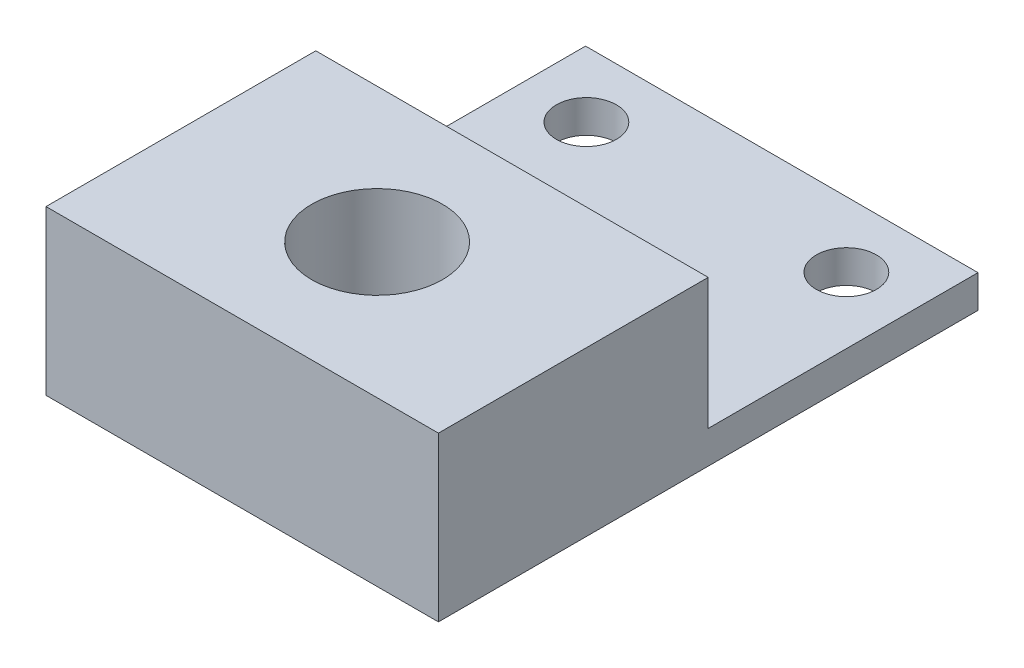
ISO-10303-21;
HEADER;
FILE_DESCRIPTION(('STEP AP214'),'2;1');
FILE_NAME('part.step','',(''),(''),'','','');
FILE_SCHEMA(('AUTOMOTIVE_DESIGN { 1 0 10303 214 1 1 1 1 }'));
ENDSEC;
DATA;
#1=APPLICATION_CONTEXT('core data for automotive mechanical design processes');
#2=APPLICATION_PROTOCOL_DEFINITION('international standard','automotive_design',2000,#1);
#3=PRODUCT_CONTEXT('',#1,'mechanical');
#4=PRODUCT('Part','Part','',(#3));
#5=PRODUCT_RELATED_PRODUCT_CATEGORY('part','',(#4));
#6=PRODUCT_DEFINITION_FORMATION('','',#4);
#7=PRODUCT_DEFINITION_CONTEXT('part definition',#1,'design');
#8=PRODUCT_DEFINITION('design','',#6,#7);
#9=PRODUCT_DEFINITION_SHAPE('','',#8);
#10=(LENGTH_UNIT() NAMED_UNIT(*) SI_UNIT(.MILLI.,.METRE.));
#11=(NAMED_UNIT(*) PLANE_ANGLE_UNIT() SI_UNIT($,.RADIAN.));
#12=(NAMED_UNIT(*) SI_UNIT($,.STERADIAN.) SOLID_ANGLE_UNIT());
#13=UNCERTAINTY_MEASURE_WITH_UNIT(LENGTH_MEASURE(1.E-05),#10,'distance_accuracy_value','');
#14=(GEOMETRIC_REPRESENTATION_CONTEXT(3) GLOBAL_UNCERTAINTY_ASSIGNED_CONTEXT((#13)) GLOBAL_UNIT_ASSIGNED_CONTEXT((#10,
#11,#12)) REPRESENTATION_CONTEXT('',''));
#15=CARTESIAN_POINT('',(0.,0.,0.));
#16=DIRECTION('',(0.,0.,1.));
#17=DIRECTION('',(1.,0.,0.));
#18=AXIS2_PLACEMENT_3D('',#15,#16,#17);
#19=CARTESIAN_POINT('',(0.,10.,0.));
#20=DIRECTION('',(0.,0.,-1.));
#21=DIRECTION('',(-1.,0.,0.));
#22=AXIS2_PLACEMENT_3D('',#19,#20,#21);
#23=PLANE('',#22);
#24=DIRECTION('',(1.,0.,0.));
#25=VECTOR('',#24,1.);
#26=CARTESIAN_POINT('',(0.,2.,0.));
#27=LINE('',#26,#25);
#28=CARTESIAN_POINT('',(-12.,2.,0.));
#29=VERTEX_POINT('',#28);
#30=CARTESIAN_POINT('',(12.,2.,0.));
#31=VERTEX_POINT('',#30);
#32=EDGE_CURVE('E59',#29,#31,#27,.T.);
#33=ORIENTED_EDGE('',*,*,#32,.F.);
#34=DIRECTION('',(0.,-1.,0.));
#35=VECTOR('',#34,1.);
#36=CARTESIAN_POINT('',(-12.,10.,0.));
#37=LINE('',#36,#35);
#38=CARTESIAN_POINT('',(-12.,10.,0.));
#39=VERTEX_POINT('',#38);
#40=EDGE_CURVE('E11',#39,#29,#37,.T.);
#41=ORIENTED_EDGE('',*,*,#40,.F.);
#42=DIRECTION('',(1.,0.,0.));
#43=VECTOR('',#42,1.);
#44=CARTESIAN_POINT('',(0.,10.,0.));
#45=LINE('',#44,#43);
#46=CARTESIAN_POINT('',(12.,10.,0.));
#47=VERTEX_POINT('',#46);
#48=EDGE_CURVE('E100',#39,#47,#45,.T.);
#49=ORIENTED_EDGE('',*,*,#48,.T.);
#50=DIRECTION('',(0.,-1.,0.));
#51=VECTOR('',#50,1.);
#52=CARTESIAN_POINT('',(12.,10.,0.));
#53=LINE('',#52,#51);
#54=EDGE_CURVE('E99',#47,#31,#53,.T.);
#55=ORIENTED_EDGE('',*,*,#54,.T.);
#56=EDGE_LOOP('',(#33,#41,#49,#55));
#57=FACE_BOUND('',#56,.T.);
#58=ADVANCED_FACE('F43',(#57),#23,.T.);
#59=CARTESIAN_POINT('',(-12.,10.,0.));
#60=DIRECTION('',(-1.,0.,0.));
#61=DIRECTION('',(0.,0.,1.));
#62=AXIS2_PLACEMENT_3D('',#59,#60,#61);
#63=PLANE('',#62);
#64=DIRECTION('',(0.,0.,-1.));
#65=VECTOR('',#64,1.);
#66=CARTESIAN_POINT('',(-12.,0.,0.));
#67=LINE('',#66,#65);
#68=CARTESIAN_POINT('',(-12.,0.,16.5));
#69=VERTEX_POINT('',#68);
#70=CARTESIAN_POINT('',(-12.,0.,-16.5));
#71=VERTEX_POINT('',#70);
#72=EDGE_CURVE('E172',#69,#71,#67,.T.);
#73=ORIENTED_EDGE('',*,*,#72,.F.);
#74=DIRECTION('',(0.,-1.,0.));
#75=VECTOR('',#74,1.);
#76=CARTESIAN_POINT('',(-12.,10.,16.5));
#77=LINE('',#76,#75);
#78=CARTESIAN_POINT('',(-12.,10.,16.5));
#79=VERTEX_POINT('',#78);
#80=EDGE_CURVE('E52',#79,#69,#77,.T.);
#81=ORIENTED_EDGE('',*,*,#80,.F.);
#82=DIRECTION('',(0.,0.,-1.));
#83=VECTOR('',#82,1.);
#84=CARTESIAN_POINT('',(-12.,10.,0.));
#85=LINE('',#84,#83);
#86=EDGE_CURVE('E159',#79,#39,#85,.T.);
#87=ORIENTED_EDGE('',*,*,#86,.T.);
#88=ORIENTED_EDGE('',*,*,#40,.T.);
#89=DIRECTION('',(0.,0.,-1.));
#90=VECTOR('',#89,1.);
#91=CARTESIAN_POINT('',(-12.,2.,0.));
#92=LINE('',#91,#90);
#93=CARTESIAN_POINT('',(-12.,2.,-16.5));
#94=VERTEX_POINT('',#93);
#95=EDGE_CURVE('E111',#29,#94,#92,.T.);
#96=ORIENTED_EDGE('',*,*,#95,.T.);
#97=DIRECTION('',(0.,-1.,0.));
#98=VECTOR('',#97,1.);
#99=CARTESIAN_POINT('',(-12.,2.,-16.5));
#100=LINE('',#99,#98);
#101=EDGE_CURVE('E133',#94,#71,#100,.T.);
#102=ORIENTED_EDGE('',*,*,#101,.T.);
#103=EDGE_LOOP('',(#73,#81,#87,#88,#96,#102));
#104=FACE_BOUND('',#103,.T.);
#105=ADVANCED_FACE('F189',(#104),#63,.T.);
#106=CARTESIAN_POINT('',(0.,10.,16.5));
#107=DIRECTION('',(0.,0.,1.));
#108=DIRECTION('',(1.,0.,0.));
#109=AXIS2_PLACEMENT_3D('',#106,#107,#108);
#110=PLANE('',#109);
#111=DIRECTION('',(-1.,0.,0.));
#112=VECTOR('',#111,1.);
#113=CARTESIAN_POINT('',(0.,0.,16.5));
#114=LINE('',#113,#112);
#115=CARTESIAN_POINT('',(12.,0.,16.5));
#116=VERTEX_POINT('',#115);
#117=EDGE_CURVE('E175',#116,#69,#114,.T.);
#118=ORIENTED_EDGE('',*,*,#117,.F.);
#119=DIRECTION('',(0.,-1.,0.));
#120=VECTOR('',#119,1.);
#121=CARTESIAN_POINT('',(12.,10.,16.5));
#122=LINE('',#121,#120);
#123=CARTESIAN_POINT('',(12.,10.,16.5));
#124=VERTEX_POINT('',#123);
#125=EDGE_CURVE('E82',#124,#116,#122,.T.);
#126=ORIENTED_EDGE('',*,*,#125,.F.);
#127=DIRECTION('',(-1.,0.,0.));
#128=VECTOR('',#127,1.);
#129=CARTESIAN_POINT('',(0.,10.,16.5));
#130=LINE('',#129,#128);
#131=EDGE_CURVE('E163',#124,#79,#130,.T.);
#132=ORIENTED_EDGE('',*,*,#131,.T.);
#133=ORIENTED_EDGE('',*,*,#80,.T.);
#134=EDGE_LOOP('',(#118,#126,#132,#133));
#135=FACE_BOUND('',#134,.T.);
#136=ADVANCED_FACE('F186',(#135),#110,.T.);
#137=CARTESIAN_POINT('',(0.,10.,8.25000000000001));
#138=DIRECTION('',(0.,-1.,0.));
#139=DIRECTION('',(0.,0.,-1.));
#140=AXIS2_PLACEMENT_3D('',#137,#138,#139);
#141=CYLINDRICAL_SURFACE('',#140,4.);
#142=CARTESIAN_POINT('',(0.,10.,8.25000000000001));
#143=DIRECTION('',(0.,1.,0.));
#144=DIRECTION('',(0.,0.,1.));
#145=AXIS2_PLACEMENT_3D('',#142,#143,#144);
#146=CIRCLE('',#145,4.);
#147=CARTESIAN_POINT('',(0.,10.,12.25));
#148=VERTEX_POINT('',#147);
#149=EDGE_CURVE('E152',#148,#148,#146,.T.);
#150=ORIENTED_EDGE('',*,*,#149,.T.);
#151=EDGE_LOOP('',(#150));
#152=FACE_BOUND('',#151,.T.);
#153=CARTESIAN_POINT('',(0.,0.,8.25000000000001));
#154=DIRECTION('',(0.,1.,0.));
#155=DIRECTION('',(0.,0.,1.));
#156=AXIS2_PLACEMENT_3D('',#153,#154,#155);
#157=CIRCLE('',#156,4.);
#158=CARTESIAN_POINT('',(0.,0.,12.25));
#159=VERTEX_POINT('',#158);
#160=EDGE_CURVE('E151',#159,#159,#157,.T.);
#161=ORIENTED_EDGE('',*,*,#160,.F.);
#162=EDGE_LOOP('',(#161));
#163=FACE_BOUND('',#162,.T.);
#164=ADVANCED_FACE('F45',(#152,#163),#141,.F.);
#165=CARTESIAN_POINT('',(12.,10.,0.));
#166=DIRECTION('',(-1.,0.,0.));
#167=DIRECTION('',(0.,0.,1.));
#168=AXIS2_PLACEMENT_3D('',#165,#166,#167);
#169=PLANE('',#168);
#170=DIRECTION('',(0.,0.,-1.));
#171=VECTOR('',#170,1.);
#172=CARTESIAN_POINT('',(12.,0.,0.));
#173=LINE('',#172,#171);
#174=CARTESIAN_POINT('',(12.,0.,-16.5));
#175=VERTEX_POINT('',#174);
#176=EDGE_CURVE('E156',#116,#175,#173,.T.);
#177=ORIENTED_EDGE('',*,*,#176,.T.);
#178=DIRECTION('',(0.,-1.,0.));
#179=VECTOR('',#178,1.);
#180=CARTESIAN_POINT('',(12.,2.,-16.5));
#181=LINE('',#180,#179);
#182=CARTESIAN_POINT('',(12.,2.,-16.5));
#183=VERTEX_POINT('',#182);
#184=EDGE_CURVE('E116',#183,#175,#181,.T.);
#185=ORIENTED_EDGE('',*,*,#184,.F.);
#186=DIRECTION('',(0.,0.,-1.));
#187=VECTOR('',#186,1.);
#188=CARTESIAN_POINT('',(12.,2.,0.));
#189=LINE('',#188,#187);
#190=EDGE_CURVE('E108',#31,#183,#189,.T.);
#191=ORIENTED_EDGE('',*,*,#190,.F.);
#192=ORIENTED_EDGE('',*,*,#54,.F.);
#193=DIRECTION('',(0.,0.,-1.));
#194=VECTOR('',#193,1.);
#195=CARTESIAN_POINT('',(12.,10.,0.));
#196=LINE('',#195,#194);
#197=EDGE_CURVE('E67',#124,#47,#196,.T.);
#198=ORIENTED_EDGE('',*,*,#197,.F.);
#199=ORIENTED_EDGE('',*,*,#125,.T.);
#200=EDGE_LOOP('',(#177,#185,#191,#192,#198,#199));
#201=FACE_BOUND('',#200,.T.);
#202=ADVANCED_FACE('F114',(#201),#169,.F.);
#203=CARTESIAN_POINT('',(0.,10.,0.));
#204=DIRECTION('',(0.,1.,0.));
#205=DIRECTION('',(0.,0.,1.));
#206=AXIS2_PLACEMENT_3D('',#203,#204,#205);
#207=PLANE('',#206);
#208=ORIENTED_EDGE('',*,*,#149,.F.);
#209=EDGE_LOOP('',(#208));
#210=FACE_BOUND('',#209,.T.);
#211=ORIENTED_EDGE('',*,*,#48,.F.);
#212=ORIENTED_EDGE('',*,*,#86,.F.);
#213=ORIENTED_EDGE('',*,*,#131,.F.);
#214=ORIENTED_EDGE('',*,*,#197,.T.);
#215=EDGE_LOOP('',(#211,#212,#213,#214));
#216=FACE_BOUND('',#215,.T.);
#217=ADVANCED_FACE('F198',(#210,#216),#207,.T.);
#218=CARTESIAN_POINT('',(0.,0.,0.));
#219=DIRECTION('',(0.,1.,0.));
#220=DIRECTION('',(0.,0.,1.));
#221=AXIS2_PLACEMENT_3D('',#218,#219,#220);
#222=PLANE('',#221);
#223=ORIENTED_EDGE('',*,*,#160,.T.);
#224=EDGE_LOOP('',(#223));
#225=FACE_BOUND('',#224,.T.);
#226=ORIENTED_EDGE('',*,*,#72,.T.);
#227=DIRECTION('',(-1.,0.,0.));
#228=VECTOR('',#227,1.);
#229=CARTESIAN_POINT('',(0.,0.,-16.5));
#230=LINE('',#229,#228);
#231=EDGE_CURVE('E134',#175,#71,#230,.T.);
#232=ORIENTED_EDGE('',*,*,#231,.F.);
#233=ORIENTED_EDGE('',*,*,#176,.F.);
#234=ORIENTED_EDGE('',*,*,#117,.T.);
#235=EDGE_LOOP('',(#226,#232,#233,#234));
#236=FACE_BOUND('',#235,.T.);
#237=CARTESIAN_POINT('',(-7.95,0.,-12.5));
#238=DIRECTION('',(0.,1.,0.));
#239=DIRECTION('',(0.,0.,1.));
#240=AXIS2_PLACEMENT_3D('',#237,#238,#239);
#241=CIRCLE('',#240,1.835);
#242=CARTESIAN_POINT('',(-7.95,0.,-10.665));
#243=VERTEX_POINT('',#242);
#244=EDGE_CURVE('E138',#243,#243,#241,.T.);
#245=ORIENTED_EDGE('',*,*,#244,.T.);
#246=EDGE_LOOP('',(#245));
#247=FACE_BOUND('',#246,.T.);
#248=CARTESIAN_POINT('',(7.95,0.,-12.5));
#249=DIRECTION('',(0.,1.,0.));
#250=DIRECTION('',(0.,0.,1.));
#251=AXIS2_PLACEMENT_3D('',#248,#249,#250);
#252=CIRCLE('',#251,1.835);
#253=CARTESIAN_POINT('',(7.95,0.,-10.665));
#254=VERTEX_POINT('',#253);
#255=EDGE_CURVE('E142',#254,#254,#252,.F.);
#256=ORIENTED_EDGE('',*,*,#255,.F.);
#257=EDGE_LOOP('',(#256));
#258=FACE_BOUND('',#257,.T.);
#259=ADVANCED_FACE('F193',(#225,#236,#247,#258),#222,.F.);
#260=CARTESIAN_POINT('',(-7.95,2.,-12.5));
#261=DIRECTION('',(0.,-1.,0.));
#262=DIRECTION('',(0.,0.,-1.));
#263=AXIS2_PLACEMENT_3D('',#260,#261,#262);
#264=CYLINDRICAL_SURFACE('',#263,1.835);
#265=CARTESIAN_POINT('',(-7.95,2.,-12.5));
#266=DIRECTION('',(0.,1.,0.));
#267=DIRECTION('',(0.,0.,1.));
#268=AXIS2_PLACEMENT_3D('',#265,#266,#267);
#269=CIRCLE('',#268,1.835);
#270=CARTESIAN_POINT('',(-7.95,2.,-10.665));
#271=VERTEX_POINT('',#270);
#272=EDGE_CURVE('E122',#271,#271,#269,.T.);
#273=ORIENTED_EDGE('',*,*,#272,.T.);
#274=EDGE_LOOP('',(#273));
#275=FACE_BOUND('',#274,.T.);
#276=ORIENTED_EDGE('',*,*,#244,.F.);
#277=EDGE_LOOP('',(#276));
#278=FACE_BOUND('',#277,.T.);
#279=ADVANCED_FACE('F206',(#275,#278),#264,.F.);
#280=CARTESIAN_POINT('',(0.,2.,-16.5));
#281=DIRECTION('',(0.,0.,1.));
#282=DIRECTION('',(1.,0.,0.));
#283=AXIS2_PLACEMENT_3D('',#280,#281,#282);
#284=PLANE('',#283);
#285=ORIENTED_EDGE('',*,*,#231,.T.);
#286=ORIENTED_EDGE('',*,*,#101,.F.);
#287=DIRECTION('',(-1.,0.,0.));
#288=VECTOR('',#287,1.);
#289=CARTESIAN_POINT('',(0.,2.,-16.5));
#290=LINE('',#289,#288);
#291=EDGE_CURVE('E119',#183,#94,#290,.T.);
#292=ORIENTED_EDGE('',*,*,#291,.F.);
#293=ORIENTED_EDGE('',*,*,#184,.T.);
#294=EDGE_LOOP('',(#285,#286,#292,#293));
#295=FACE_BOUND('',#294,.T.);
#296=ADVANCED_FACE('F196',(#295),#284,.F.);
#297=CARTESIAN_POINT('',(7.95,2.,-12.5));
#298=DIRECTION('',(0.,-1.,0.));
#299=DIRECTION('',(0.,0.,-1.));
#300=AXIS2_PLACEMENT_3D('',#297,#298,#299);
#301=CYLINDRICAL_SURFACE('',#300,1.835);
#302=CARTESIAN_POINT('',(7.95,2.,-12.5));
#303=DIRECTION('',(0.,1.,0.));
#304=DIRECTION('',(0.,0.,1.));
#305=AXIS2_PLACEMENT_3D('',#302,#303,#304);
#306=CIRCLE('',#305,1.835);
#307=CARTESIAN_POINT('',(7.95,2.,-10.665));
#308=VERTEX_POINT('',#307);
#309=EDGE_CURVE('E129',#308,#308,#306,.F.);
#310=ORIENTED_EDGE('',*,*,#309,.F.);
#311=EDGE_LOOP('',(#310));
#312=FACE_BOUND('',#311,.T.);
#313=ORIENTED_EDGE('',*,*,#255,.T.);
#314=EDGE_LOOP('',(#313));
#315=FACE_BOUND('',#314,.T.);
#316=ADVANCED_FACE('F261',(#312,#315),#301,.F.);
#317=CARTESIAN_POINT('',(0.,2.,0.));
#318=DIRECTION('',(0.,1.,0.));
#319=DIRECTION('',(0.,0.,1.));
#320=AXIS2_PLACEMENT_3D('',#317,#318,#319);
#321=PLANE('',#320);
#322=ORIENTED_EDGE('',*,*,#95,.F.);
#323=ORIENTED_EDGE('',*,*,#32,.T.);
#324=ORIENTED_EDGE('',*,*,#190,.T.);
#325=ORIENTED_EDGE('',*,*,#291,.T.);
#326=EDGE_LOOP('',(#322,#323,#324,#325));
#327=FACE_BOUND('',#326,.T.);
#328=ORIENTED_EDGE('',*,*,#272,.F.);
#329=EDGE_LOOP('',(#328));
#330=FACE_BOUND('',#329,.T.);
#331=ORIENTED_EDGE('',*,*,#309,.T.);
#332=EDGE_LOOP('',(#331));
#333=FACE_BOUND('',#332,.T.);
#334=ADVANCED_FACE('F106',(#327,#330,#333),#321,.T.);
#335=CLOSED_SHELL('',(#58,#105,#136,#164,#202,#217,#259,#279,#296,#316,#334));
#336=MANIFOLD_SOLID_BREP('B2',#335);
#337=ADVANCED_BREP_SHAPE_REPRESENTATION('',(#18,#336),#14);
#338=SHAPE_DEFINITION_REPRESENTATION(#9,#337);
ENDSEC;
END-ISO-10303-21;
